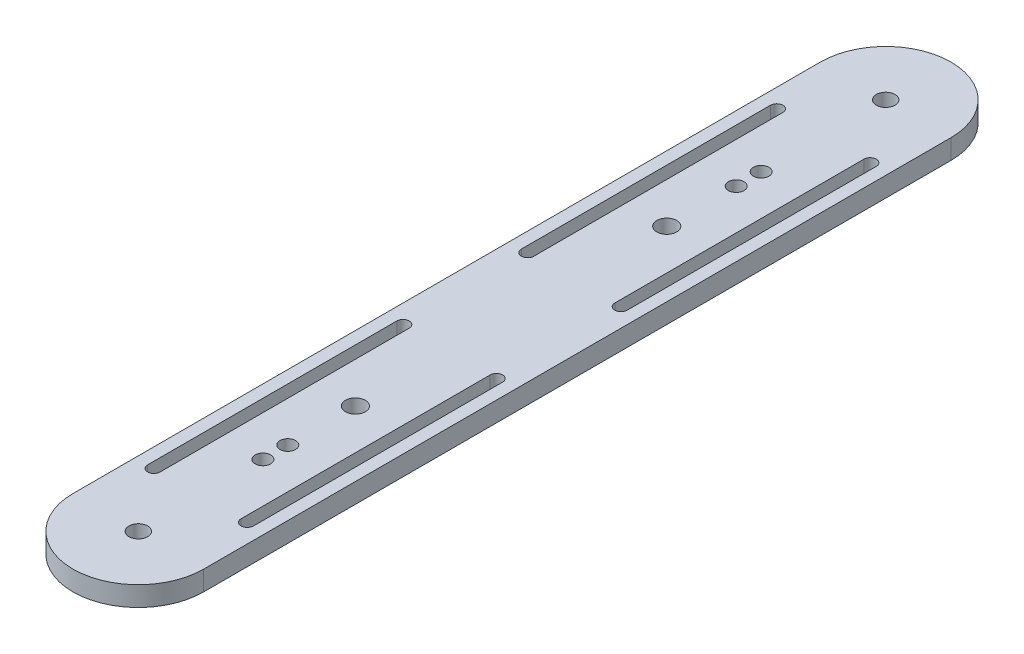
ISO-10303-21;
HEADER;
FILE_DESCRIPTION(('STEP AP214'),'2;1');
FILE_NAME('part.step','',(''),(''),'','','');
FILE_SCHEMA(('AUTOMOTIVE_DESIGN { 1 0 10303 214 1 1 1 1 }'));
ENDSEC;
DATA;
#1=APPLICATION_CONTEXT('core data for automotive mechanical design processes');
#2=APPLICATION_PROTOCOL_DEFINITION('international standard','automotive_design',2000,#1);
#3=PRODUCT_CONTEXT('',#1,'mechanical');
#4=PRODUCT('Part','Part','',(#3));
#5=PRODUCT_RELATED_PRODUCT_CATEGORY('part','',(#4));
#6=PRODUCT_DEFINITION_FORMATION('','',#4);
#7=PRODUCT_DEFINITION_CONTEXT('part definition',#1,'design');
#8=PRODUCT_DEFINITION('design','',#6,#7);
#9=PRODUCT_DEFINITION_SHAPE('','',#8);
#10=(LENGTH_UNIT() NAMED_UNIT(*) SI_UNIT(.MILLI.,.METRE.));
#11=(NAMED_UNIT(*) PLANE_ANGLE_UNIT() SI_UNIT($,.RADIAN.));
#12=(NAMED_UNIT(*) SI_UNIT($,.STERADIAN.) SOLID_ANGLE_UNIT());
#13=UNCERTAINTY_MEASURE_WITH_UNIT(LENGTH_MEASURE(1.E-05),#10,'distance_accuracy_value','');
#14=(GEOMETRIC_REPRESENTATION_CONTEXT(3) GLOBAL_UNCERTAINTY_ASSIGNED_CONTEXT((#13)) GLOBAL_UNIT_ASSIGNED_CONTEXT((#10,
#11,#12)) REPRESENTATION_CONTEXT('',''));
#15=CARTESIAN_POINT('',(0.,0.,0.));
#16=DIRECTION('',(0.,0.,1.));
#17=DIRECTION('',(1.,0.,0.));
#18=AXIS2_PLACEMENT_3D('',#15,#16,#17);
#19=CARTESIAN_POINT('',(0.,3.175,0.));
#20=DIRECTION('',(0.,1.,0.));
#21=DIRECTION('',(0.,0.,1.));
#22=AXIS2_PLACEMENT_3D('',#19,#20,#21);
#23=PLANE('',#22);
#24=CARTESIAN_POINT('',(-7.50000000000002,3.175,70.));
#25=DIRECTION('',(0.,1.,0.));
#26=DIRECTION('',(0.,0.,1.));
#27=AXIS2_PLACEMENT_3D('',#24,#25,#26);
#28=CIRCLE('',#27,0.999999999999999);
#29=CARTESIAN_POINT('',(-6.5,3.175,70.));
#30=VERTEX_POINT('',#29);
#31=CARTESIAN_POINT('',(-8.5,3.175,70.));
#32=VERTEX_POINT('',#31);
#33=EDGE_CURVE('E293',#30,#32,#28,.T.);
#34=ORIENTED_EDGE('',*,*,#33,.F.);
#35=DIRECTION('',(0.,0.,-1.));
#36=VECTOR('',#35,1.);
#37=CARTESIAN_POINT('',(-6.5,3.175,0.));
#38=LINE('',#37,#36);
#39=CARTESIAN_POINT('',(-6.5,3.175,110.));
#40=VERTEX_POINT('',#39);
#41=EDGE_CURVE('E287',#40,#30,#38,.T.);
#42=ORIENTED_EDGE('',*,*,#41,.F.);
#43=CARTESIAN_POINT('',(-7.50000000000013,3.175,110.));
#44=DIRECTION('',(0.,1.,0.));
#45=DIRECTION('',(0.,0.,1.));
#46=AXIS2_PLACEMENT_3D('',#43,#44,#45);
#47=CIRCLE('',#46,0.999999999999999);
#48=CARTESIAN_POINT('',(-8.50000000000013,3.175,110.));
#49=VERTEX_POINT('',#48);
#50=EDGE_CURVE('E289',#49,#40,#47,.T.);
#51=ORIENTED_EDGE('',*,*,#50,.F.);
#52=DIRECTION('',(0.,0.,1.));
#53=VECTOR('',#52,1.);
#54=CARTESIAN_POINT('',(-8.5,3.175,0.));
#55=LINE('',#54,#53);
#56=EDGE_CURVE('E291',#32,#49,#55,.T.);
#57=ORIENTED_EDGE('',*,*,#56,.F.);
#58=EDGE_LOOP('',(#34,#42,#51,#57));
#59=FACE_BOUND('',#58,.T.);
#60=CARTESIAN_POINT('',(7.49999999999986,3.175,110.));
#61=DIRECTION('',(0.,1.,0.));
#62=DIRECTION('',(0.,0.,1.));
#63=AXIS2_PLACEMENT_3D('',#60,#61,#62);
#64=CIRCLE('',#63,0.999999999999999);
#65=CARTESIAN_POINT('',(6.5,3.175,110.));
#66=VERTEX_POINT('',#65);
#67=CARTESIAN_POINT('',(8.5,3.175,110.));
#68=VERTEX_POINT('',#67);
#69=EDGE_CURVE('E285',#66,#68,#64,.T.);
#70=ORIENTED_EDGE('',*,*,#69,.F.);
#71=DIRECTION('',(0.,0.,1.));
#72=VECTOR('',#71,1.);
#73=CARTESIAN_POINT('',(6.5,3.175,0.));
#74=LINE('',#73,#72);
#75=CARTESIAN_POINT('',(6.5,3.175,70.));
#76=VERTEX_POINT('',#75);
#77=EDGE_CURVE('E279',#76,#66,#74,.T.);
#78=ORIENTED_EDGE('',*,*,#77,.F.);
#79=CARTESIAN_POINT('',(7.49999999999997,3.175,70.));
#80=DIRECTION('',(0.,1.,0.));
#81=DIRECTION('',(0.,0.,1.));
#82=AXIS2_PLACEMENT_3D('',#79,#80,#81);
#83=CIRCLE('',#82,0.999999999999999);
#84=CARTESIAN_POINT('',(8.5,3.175,70.));
#85=VERTEX_POINT('',#84);
#86=EDGE_CURVE('E281',#85,#76,#83,.T.);
#87=ORIENTED_EDGE('',*,*,#86,.F.);
#88=DIRECTION('',(0.,0.,-1.));
#89=VECTOR('',#88,1.);
#90=CARTESIAN_POINT('',(8.5,3.175,0.));
#91=LINE('',#90,#89);
#92=EDGE_CURVE('E283',#68,#85,#91,.T.);
#93=ORIENTED_EDGE('',*,*,#92,.F.);
#94=EDGE_LOOP('',(#70,#78,#87,#93));
#95=FACE_BOUND('',#94,.T.);
#96=CARTESIAN_POINT('',(7.5,3.175,50.));
#97=DIRECTION('',(0.,1.,0.));
#98=DIRECTION('',(0.,0.,1.));
#99=AXIS2_PLACEMENT_3D('',#96,#97,#98);
#100=CIRCLE('',#99,0.999999999999999);
#101=CARTESIAN_POINT('',(6.5,3.175,50.));
#102=VERTEX_POINT('',#101);
#103=CARTESIAN_POINT('',(8.5,3.175,50.));
#104=VERTEX_POINT('',#103);
#105=EDGE_CURVE('E277',#102,#104,#100,.T.);
#106=ORIENTED_EDGE('',*,*,#105,.F.);
#107=DIRECTION('',(0.,0.,1.));
#108=VECTOR('',#107,1.);
#109=CARTESIAN_POINT('',(6.5,3.175,0.));
#110=LINE('',#109,#108);
#111=CARTESIAN_POINT('',(6.5,3.175,9.99999999999999));
#112=VERTEX_POINT('',#111);
#113=EDGE_CURVE('E272',#112,#102,#110,.T.);
#114=ORIENTED_EDGE('',*,*,#113,.F.);
#115=CARTESIAN_POINT('',(7.5,3.175,10.));
#116=DIRECTION('',(0.,1.,0.));
#117=DIRECTION('',(0.,0.,1.));
#118=AXIS2_PLACEMENT_3D('',#115,#116,#117);
#119=CIRCLE('',#118,0.999999999999999);
#120=CARTESIAN_POINT('',(8.49999999999999,3.175,10.));
#121=VERTEX_POINT('',#120);
#122=EDGE_CURVE('E180',#121,#112,#119,.T.);
#123=ORIENTED_EDGE('',*,*,#122,.F.);
#124=DIRECTION('',(0.,0.,-1.));
#125=VECTOR('',#124,1.);
#126=CARTESIAN_POINT('',(8.5,3.175,0.));
#127=LINE('',#126,#125);
#128=EDGE_CURVE('E275',#104,#121,#127,.T.);
#129=ORIENTED_EDGE('',*,*,#128,.F.);
#130=EDGE_LOOP('',(#106,#114,#123,#129));
#131=FACE_BOUND('',#130,.T.);
#132=CARTESIAN_POINT('',(-7.5,3.175,50.));
#133=DIRECTION('',(0.,1.,0.));
#134=DIRECTION('',(0.,0.,1.));
#135=AXIS2_PLACEMENT_3D('',#132,#133,#134);
#136=CIRCLE('',#135,0.999999999999999);
#137=CARTESIAN_POINT('',(-8.5,3.175,50.));
#138=VERTEX_POINT('',#137);
#139=CARTESIAN_POINT('',(-6.5,3.175,50.));
#140=VERTEX_POINT('',#139);
#141=EDGE_CURVE('E270',#138,#140,#136,.T.);
#142=ORIENTED_EDGE('',*,*,#141,.F.);
#143=DIRECTION('',(0.,0.,1.));
#144=VECTOR('',#143,1.);
#145=CARTESIAN_POINT('',(-8.5,3.175,0.));
#146=LINE('',#145,#144);
#147=CARTESIAN_POINT('',(-8.5,3.175,10.));
#148=VERTEX_POINT('',#147);
#149=EDGE_CURVE('E257',#148,#138,#146,.T.);
#150=ORIENTED_EDGE('',*,*,#149,.F.);
#151=CARTESIAN_POINT('',(-7.5,3.175,10.));
#152=DIRECTION('',(0.,1.,0.));
#153=DIRECTION('',(0.,0.,1.));
#154=AXIS2_PLACEMENT_3D('',#151,#152,#153);
#155=CIRCLE('',#154,0.999999999999999);
#156=CARTESIAN_POINT('',(-6.5,3.175,9.99999999999999));
#157=VERTEX_POINT('',#156);
#158=EDGE_CURVE('E265',#157,#148,#155,.T.);
#159=ORIENTED_EDGE('',*,*,#158,.F.);
#160=DIRECTION('',(0.,0.,-1.));
#161=VECTOR('',#160,1.);
#162=CARTESIAN_POINT('',(-6.5,3.175,0.));
#163=LINE('',#162,#161);
#164=EDGE_CURVE('E268',#140,#157,#163,.T.);
#165=ORIENTED_EDGE('',*,*,#164,.F.);
#166=EDGE_LOOP('',(#142,#150,#159,#165));
#167=FACE_BOUND('',#166,.T.);
#168=CARTESIAN_POINT('',(0.,3.175,35.15));
#169=DIRECTION('',(0.,1.,0.));
#170=DIRECTION('',(0.,0.,1.));
#171=AXIS2_PLACEMENT_3D('',#168,#169,#170);
#172=CIRCLE('',#171,1.6);
#173=CARTESIAN_POINT('',(0.,3.175,36.75));
#174=VERTEX_POINT('',#173);
#175=EDGE_CURVE('E304',#174,#174,#172,.T.);
#176=ORIENTED_EDGE('',*,*,#175,.F.);
#177=EDGE_LOOP('',(#176));
#178=FACE_BOUND('',#177,.T.);
#179=CARTESIAN_POINT('',(0.,3.175,85.15));
#180=DIRECTION('',(0.,1.,0.));
#181=DIRECTION('',(0.,0.,1.));
#182=AXIS2_PLACEMENT_3D('',#179,#180,#181);
#183=CIRCLE('',#182,1.59999999999999);
#184=CARTESIAN_POINT('',(0.,3.175,86.75));
#185=VERTEX_POINT('',#184);
#186=EDGE_CURVE('E299',#185,#185,#183,.T.);
#187=ORIENTED_EDGE('',*,*,#186,.F.);
#188=EDGE_LOOP('',(#187));
#189=FACE_BOUND('',#188,.T.);
#190=CARTESIAN_POINT('',(0.,3.175,96.));
#191=DIRECTION('',(0.,1.,0.));
#192=DIRECTION('',(0.,0.,1.));
#193=AXIS2_PLACEMENT_3D('',#190,#191,#192);
#194=CIRCLE('',#193,1.25);
#195=CARTESIAN_POINT('',(0.,3.175,97.25));
#196=VERTEX_POINT('',#195);
#197=EDGE_CURVE('E316',#196,#196,#194,.T.);
#198=ORIENTED_EDGE('',*,*,#197,.F.);
#199=EDGE_LOOP('',(#198));
#200=FACE_BOUND('',#199,.T.);
#201=CARTESIAN_POINT('',(0.,3.175,100.));
#202=DIRECTION('',(0.,1.,0.));
#203=DIRECTION('',(0.,0.,1.));
#204=AXIS2_PLACEMENT_3D('',#201,#202,#203);
#205=CIRCLE('',#204,1.25);
#206=CARTESIAN_POINT('',(0.,3.175,101.25));
#207=VERTEX_POINT('',#206);
#208=EDGE_CURVE('E311',#207,#207,#205,.T.);
#209=ORIENTED_EDGE('',*,*,#208,.F.);
#210=EDGE_LOOP('',(#209));
#211=FACE_BOUND('',#210,.T.);
#212=CARTESIAN_POINT('',(0.,3.175,20.));
#213=DIRECTION('',(0.,-1.,0.));
#214=DIRECTION('',(0.,0.,-1.));
#215=AXIS2_PLACEMENT_3D('',#212,#213,#214);
#216=CIRCLE('',#215,1.25);
#217=CARTESIAN_POINT('',(0.,3.175,18.75));
#218=VERTEX_POINT('',#217);
#219=EDGE_CURVE('E320',#218,#218,#216,.T.);
#220=ORIENTED_EDGE('',*,*,#219,.T.);
#221=EDGE_LOOP('',(#220));
#222=FACE_BOUND('',#221,.T.);
#223=CARTESIAN_POINT('',(0.,3.175,24.));
#224=DIRECTION('',(0.,-1.,0.));
#225=DIRECTION('',(0.,0.,-1.));
#226=AXIS2_PLACEMENT_3D('',#223,#224,#225);
#227=CIRCLE('',#226,1.25);
#228=CARTESIAN_POINT('',(0.,3.175,22.75));
#229=VERTEX_POINT('',#228);
#230=EDGE_CURVE('E319',#229,#229,#227,.T.);
#231=ORIENTED_EDGE('',*,*,#230,.T.);
#232=EDGE_LOOP('',(#231));
#233=FACE_BOUND('',#232,.T.);
#234=CARTESIAN_POINT('',(0.,3.175,0.));
#235=DIRECTION('',(0.,1.,0.));
#236=DIRECTION('',(0.,0.,1.));
#237=AXIS2_PLACEMENT_3D('',#234,#235,#236);
#238=CIRCLE('',#237,1.5);
#239=CARTESIAN_POINT('',(0.,3.175,1.5));
#240=VERTEX_POINT('',#239);
#241=EDGE_CURVE('E333',#240,#240,#238,.T.);
#242=ORIENTED_EDGE('',*,*,#241,.F.);
#243=EDGE_LOOP('',(#242));
#244=FACE_BOUND('',#243,.T.);
#245=CARTESIAN_POINT('',(0.,3.175,0.));
#246=DIRECTION('',(0.,1.,0.));
#247=DIRECTION('',(0.,0.,1.));
#248=AXIS2_PLACEMENT_3D('',#245,#246,#247);
#249=CIRCLE('',#248,10.5);
#250=CARTESIAN_POINT('',(10.5,3.175,0.));
#251=VERTEX_POINT('',#250);
#252=CARTESIAN_POINT('',(-10.5,3.175,0.));
#253=VERTEX_POINT('',#252);
#254=EDGE_CURVE('E339',#251,#253,#249,.T.);
#255=ORIENTED_EDGE('',*,*,#254,.T.);
#256=DIRECTION('',(0.,0.,1.));
#257=VECTOR('',#256,1.);
#258=CARTESIAN_POINT('',(-10.5,3.175,0.));
#259=LINE('',#258,#257);
#260=CARTESIAN_POINT('',(-10.5,3.175,120.));
#261=VERTEX_POINT('',#260);
#262=EDGE_CURVE('E342',#253,#261,#259,.T.);
#263=ORIENTED_EDGE('',*,*,#262,.T.);
#264=CARTESIAN_POINT('',(0.,3.175,120.));
#265=DIRECTION('',(0.,1.,0.));
#266=DIRECTION('',(0.,0.,1.));
#267=AXIS2_PLACEMENT_3D('',#264,#265,#266);
#268=CIRCLE('',#267,10.5);
#269=CARTESIAN_POINT('',(10.5,3.175,120.));
#270=VERTEX_POINT('',#269);
#271=EDGE_CURVE('E345',#261,#270,#268,.T.);
#272=ORIENTED_EDGE('',*,*,#271,.T.);
#273=DIRECTION('',(0.,0.,-1.));
#274=VECTOR('',#273,1.);
#275=CARTESIAN_POINT('',(10.5,3.175,0.));
#276=LINE('',#275,#274);
#277=EDGE_CURVE('E347',#270,#251,#276,.T.);
#278=ORIENTED_EDGE('',*,*,#277,.T.);
#279=EDGE_LOOP('',(#255,#263,#272,#278));
#280=FACE_BOUND('',#279,.T.);
#281=CARTESIAN_POINT('',(0.,3.175,120.));
#282=DIRECTION('',(0.,1.,0.));
#283=DIRECTION('',(0.,0.,1.));
#284=AXIS2_PLACEMENT_3D('',#281,#282,#283);
#285=CIRCLE('',#284,1.5);
#286=CARTESIAN_POINT('',(0.,3.175,121.5));
#287=VERTEX_POINT('',#286);
#288=EDGE_CURVE('E326',#287,#287,#285,.T.);
#289=ORIENTED_EDGE('',*,*,#288,.F.);
#290=EDGE_LOOP('',(#289));
#291=FACE_BOUND('',#290,.T.);
#292=ADVANCED_FACE('F33',(#59,#95,#131,#167,#178,#189,#200,#211,#222,#233,#244,#280,#291),#23,.T.);
#293=CARTESIAN_POINT('',(0.,0.,0.));
#294=DIRECTION('',(0.,1.,0.));
#295=DIRECTION('',(0.,0.,1.));
#296=AXIS2_PLACEMENT_3D('',#293,#294,#295);
#297=PLANE('',#296);
#298=DIRECTION('',(0.,0.,1.));
#299=VECTOR('',#298,1.);
#300=CARTESIAN_POINT('',(-6.5,0.,70.));
#301=LINE('',#300,#299);
#302=CARTESIAN_POINT('',(-6.5,0.,70.));
#303=VERTEX_POINT('',#302);
#304=CARTESIAN_POINT('',(-6.5,0.,110.));
#305=VERTEX_POINT('',#304);
#306=EDGE_CURVE('E229',#303,#305,#301,.T.);
#307=ORIENTED_EDGE('',*,*,#306,.F.);
#308=CARTESIAN_POINT('',(-7.50000000000002,0.,70.));
#309=DIRECTION('',(0.,-1.,0.));
#310=DIRECTION('',(0.,0.,1.));
#311=AXIS2_PLACEMENT_3D('',#308,#309,#310);
#312=CIRCLE('',#311,0.999999999999999);
#313=CARTESIAN_POINT('',(-8.5,0.,70.));
#314=VERTEX_POINT('',#313);
#315=EDGE_CURVE('E227',#314,#303,#312,.T.);
#316=ORIENTED_EDGE('',*,*,#315,.F.);
#317=DIRECTION('',(0.,0.,-1.));
#318=VECTOR('',#317,1.);
#319=CARTESIAN_POINT('',(-8.5,0.,110.));
#320=LINE('',#319,#318);
#321=CARTESIAN_POINT('',(-8.50000000000013,0.,110.));
#322=VERTEX_POINT('',#321);
#323=EDGE_CURVE('E234',#322,#314,#320,.T.);
#324=ORIENTED_EDGE('',*,*,#323,.F.);
#325=CARTESIAN_POINT('',(-7.50000000000013,0.,110.));
#326=DIRECTION('',(0.,-1.,0.));
#327=DIRECTION('',(0.,0.,1.));
#328=AXIS2_PLACEMENT_3D('',#325,#326,#327);
#329=CIRCLE('',#328,0.999999999999999);
#330=EDGE_CURVE('E231',#305,#322,#329,.T.);
#331=ORIENTED_EDGE('',*,*,#330,.F.);
#332=EDGE_LOOP('',(#307,#316,#324,#331));
#333=FACE_BOUND('',#332,.T.);
#334=DIRECTION('',(0.,0.,-1.));
#335=VECTOR('',#334,1.);
#336=CARTESIAN_POINT('',(6.5,0.,70.));
#337=LINE('',#336,#335);
#338=CARTESIAN_POINT('',(6.5,0.,110.));
#339=VERTEX_POINT('',#338);
#340=CARTESIAN_POINT('',(6.49999999999997,0.,70.));
#341=VERTEX_POINT('',#340);
#342=EDGE_CURVE('E210',#339,#341,#337,.T.);
#343=ORIENTED_EDGE('',*,*,#342,.F.);
#344=CARTESIAN_POINT('',(7.49999999999986,0.,110.));
#345=DIRECTION('',(0.,-1.,0.));
#346=DIRECTION('',(0.,0.,-1.));
#347=AXIS2_PLACEMENT_3D('',#344,#345,#346);
#348=CIRCLE('',#347,0.999999999999999);
#349=CARTESIAN_POINT('',(8.5,0.,110.));
#350=VERTEX_POINT('',#349);
#351=EDGE_CURVE('E208',#350,#339,#348,.T.);
#352=ORIENTED_EDGE('',*,*,#351,.F.);
#353=DIRECTION('',(0.,0.,1.));
#354=VECTOR('',#353,1.);
#355=CARTESIAN_POINT('',(8.5,0.,110.));
#356=LINE('',#355,#354);
#357=CARTESIAN_POINT('',(8.5,0.,70.));
#358=VERTEX_POINT('',#357);
#359=EDGE_CURVE('E216',#358,#350,#356,.T.);
#360=ORIENTED_EDGE('',*,*,#359,.F.);
#361=CARTESIAN_POINT('',(7.49999999999997,0.,70.));
#362=DIRECTION('',(0.,-1.,0.));
#363=DIRECTION('',(0.,0.,-1.));
#364=AXIS2_PLACEMENT_3D('',#361,#362,#363);
#365=CIRCLE('',#364,0.999999999999999);
#366=EDGE_CURVE('E213',#341,#358,#365,.T.);
#367=ORIENTED_EDGE('',*,*,#366,.F.);
#368=EDGE_LOOP('',(#343,#352,#360,#367));
#369=FACE_BOUND('',#368,.T.);
#370=DIRECTION('',(0.,0.,-1.));
#371=VECTOR('',#370,1.);
#372=CARTESIAN_POINT('',(6.5,0.,50.));
#373=LINE('',#372,#371);
#374=CARTESIAN_POINT('',(6.5,0.,50.));
#375=VERTEX_POINT('',#374);
#376=CARTESIAN_POINT('',(6.5,0.,9.99999999999999));
#377=VERTEX_POINT('',#376);
#378=EDGE_CURVE('E188',#375,#377,#373,.T.);
#379=ORIENTED_EDGE('',*,*,#378,.F.);
#380=CARTESIAN_POINT('',(7.5,0.,50.));
#381=DIRECTION('',(0.,-1.,0.));
#382=DIRECTION('',(0.,0.,1.));
#383=AXIS2_PLACEMENT_3D('',#380,#381,#382);
#384=CIRCLE('',#383,0.999999999999999);
#385=CARTESIAN_POINT('',(8.5,0.,50.));
#386=VERTEX_POINT('',#385);
#387=EDGE_CURVE('E193',#386,#375,#384,.T.);
#388=ORIENTED_EDGE('',*,*,#387,.F.);
#389=DIRECTION('',(0.,0.,1.));
#390=VECTOR('',#389,1.);
#391=CARTESIAN_POINT('',(8.5,0.,10.));
#392=LINE('',#391,#390);
#393=CARTESIAN_POINT('',(8.49999999999999,0.,10.));
#394=VERTEX_POINT('',#393);
#395=EDGE_CURVE('E198',#394,#386,#392,.T.);
#396=ORIENTED_EDGE('',*,*,#395,.F.);
#397=CARTESIAN_POINT('',(7.5,0.,10.));
#398=DIRECTION('',(0.,-1.,0.));
#399=DIRECTION('',(0.,0.,1.));
#400=AXIS2_PLACEMENT_3D('',#397,#398,#399);
#401=CIRCLE('',#400,0.999999999999999);
#402=EDGE_CURVE('E177',#377,#394,#401,.T.);
#403=ORIENTED_EDGE('',*,*,#402,.F.);
#404=EDGE_LOOP('',(#379,#388,#396,#403));
#405=FACE_BOUND('',#404,.T.);
#406=DIRECTION('',(0.,0.,-1.));
#407=VECTOR('',#406,1.);
#408=CARTESIAN_POINT('',(-8.5,0.,10.));
#409=LINE('',#408,#407);
#410=CARTESIAN_POINT('',(-8.5,0.,50.));
#411=VERTEX_POINT('',#410);
#412=CARTESIAN_POINT('',(-8.5,0.,10.));
#413=VERTEX_POINT('',#412);
#414=EDGE_CURVE('E245',#411,#413,#409,.T.);
#415=ORIENTED_EDGE('',*,*,#414,.F.);
#416=CARTESIAN_POINT('',(-7.5,0.,50.));
#417=DIRECTION('',(0.,-1.,0.));
#418=DIRECTION('',(0.,0.,-1.));
#419=AXIS2_PLACEMENT_3D('',#416,#417,#418);
#420=CIRCLE('',#419,0.999999999999999);
#421=CARTESIAN_POINT('',(-6.5,0.,50.));
#422=VERTEX_POINT('',#421);
#423=EDGE_CURVE('E205',#422,#411,#420,.T.);
#424=ORIENTED_EDGE('',*,*,#423,.F.);
#425=DIRECTION('',(0.,0.,1.));
#426=VECTOR('',#425,1.);
#427=CARTESIAN_POINT('',(-6.5,0.,50.));
#428=LINE('',#427,#426);
#429=CARTESIAN_POINT('',(-6.5,0.,9.99999999999999));
#430=VERTEX_POINT('',#429);
#431=EDGE_CURVE('E251',#430,#422,#428,.T.);
#432=ORIENTED_EDGE('',*,*,#431,.F.);
#433=CARTESIAN_POINT('',(-7.5,0.,10.));
#434=DIRECTION('',(0.,-1.,0.));
#435=DIRECTION('',(0.,0.,-1.));
#436=AXIS2_PLACEMENT_3D('',#433,#434,#435);
#437=CIRCLE('',#436,0.999999999999999);
#438=EDGE_CURVE('E248',#413,#430,#437,.T.);
#439=ORIENTED_EDGE('',*,*,#438,.F.);
#440=EDGE_LOOP('',(#415,#424,#432,#439));
#441=FACE_BOUND('',#440,.T.);
#442=CARTESIAN_POINT('',(0.,0.,35.15));
#443=DIRECTION('',(0.,1.,0.));
#444=DIRECTION('',(0.,0.,1.));
#445=AXIS2_PLACEMENT_3D('',#442,#443,#444);
#446=CIRCLE('',#445,1.6);
#447=CARTESIAN_POINT('',(0.,0.,36.75));
#448=VERTEX_POINT('',#447);
#449=EDGE_CURVE('E296',#448,#448,#446,.T.);
#450=ORIENTED_EDGE('',*,*,#449,.T.);
#451=EDGE_LOOP('',(#450));
#452=FACE_BOUND('',#451,.T.);
#453=CARTESIAN_POINT('',(0.,0.,85.15));
#454=DIRECTION('',(0.,1.,0.));
#455=DIRECTION('',(0.,0.,1.));
#456=AXIS2_PLACEMENT_3D('',#453,#454,#455);
#457=CIRCLE('',#456,1.59999999999999);
#458=CARTESIAN_POINT('',(0.,0.,86.75));
#459=VERTEX_POINT('',#458);
#460=EDGE_CURVE('E295',#459,#459,#457,.T.);
#461=ORIENTED_EDGE('',*,*,#460,.T.);
#462=EDGE_LOOP('',(#461));
#463=FACE_BOUND('',#462,.T.);
#464=CARTESIAN_POINT('',(0.,0.,96.));
#465=DIRECTION('',(0.,1.,0.));
#466=DIRECTION('',(0.,0.,1.));
#467=AXIS2_PLACEMENT_3D('',#464,#465,#466);
#468=CIRCLE('',#467,1.25);
#469=CARTESIAN_POINT('',(0.,0.,97.25));
#470=VERTEX_POINT('',#469);
#471=EDGE_CURVE('E308',#470,#470,#468,.T.);
#472=ORIENTED_EDGE('',*,*,#471,.T.);
#473=EDGE_LOOP('',(#472));
#474=FACE_BOUND('',#473,.T.);
#475=CARTESIAN_POINT('',(0.,0.,100.));
#476=DIRECTION('',(0.,1.,0.));
#477=DIRECTION('',(0.,0.,1.));
#478=AXIS2_PLACEMENT_3D('',#475,#476,#477);
#479=CIRCLE('',#478,1.25);
#480=CARTESIAN_POINT('',(0.,0.,101.25));
#481=VERTEX_POINT('',#480);
#482=EDGE_CURVE('E307',#481,#481,#479,.T.);
#483=ORIENTED_EDGE('',*,*,#482,.T.);
#484=EDGE_LOOP('',(#483));
#485=FACE_BOUND('',#484,.T.);
#486=CARTESIAN_POINT('',(0.,0.,20.));
#487=DIRECTION('',(0.,1.,0.));
#488=DIRECTION('',(0.,0.,1.));
#489=AXIS2_PLACEMENT_3D('',#486,#487,#488);
#490=CIRCLE('',#489,1.25);
#491=CARTESIAN_POINT('',(0.,0.,21.25));
#492=VERTEX_POINT('',#491);
#493=EDGE_CURVE('E37',#492,#492,#490,.T.);
#494=ORIENTED_EDGE('',*,*,#493,.T.);
#495=EDGE_LOOP('',(#494));
#496=FACE_BOUND('',#495,.T.);
#497=CARTESIAN_POINT('',(0.,0.,24.));
#498=DIRECTION('',(0.,1.,0.));
#499=DIRECTION('',(0.,0.,1.));
#500=AXIS2_PLACEMENT_3D('',#497,#498,#499);
#501=CIRCLE('',#500,1.25);
#502=CARTESIAN_POINT('',(0.,0.,25.25));
#503=VERTEX_POINT('',#502);
#504=EDGE_CURVE('E323',#503,#503,#501,.T.);
#505=ORIENTED_EDGE('',*,*,#504,.T.);
#506=EDGE_LOOP('',(#505));
#507=FACE_BOUND('',#506,.T.);
#508=CARTESIAN_POINT('',(0.,0.,0.));
#509=DIRECTION('',(0.,1.,0.));
#510=DIRECTION('',(0.,0.,1.));
#511=AXIS2_PLACEMENT_3D('',#508,#509,#510);
#512=CIRCLE('',#511,10.5);
#513=CARTESIAN_POINT('',(10.5,0.,0.));
#514=VERTEX_POINT('',#513);
#515=CARTESIAN_POINT('',(-10.5,0.,0.));
#516=VERTEX_POINT('',#515);
#517=EDGE_CURVE('E336',#514,#516,#512,.T.);
#518=ORIENTED_EDGE('',*,*,#517,.F.);
#519=DIRECTION('',(0.,0.,-1.));
#520=VECTOR('',#519,1.);
#521=CARTESIAN_POINT('',(10.5,0.,0.));
#522=LINE('',#521,#520);
#523=CARTESIAN_POINT('',(10.5,0.,120.));
#524=VERTEX_POINT('',#523);
#525=EDGE_CURVE('E343',#524,#514,#522,.T.);
#526=ORIENTED_EDGE('',*,*,#525,.F.);
#527=CARTESIAN_POINT('',(0.,0.,120.));
#528=DIRECTION('',(0.,1.,0.));
#529=DIRECTION('',(0.,0.,1.));
#530=AXIS2_PLACEMENT_3D('',#527,#528,#529);
#531=CIRCLE('',#530,10.5);
#532=CARTESIAN_POINT('',(-10.5,0.,120.));
#533=VERTEX_POINT('',#532);
#534=EDGE_CURVE('E354',#533,#524,#531,.T.);
#535=ORIENTED_EDGE('',*,*,#534,.F.);
#536=DIRECTION('',(0.,0.,1.));
#537=VECTOR('',#536,1.);
#538=CARTESIAN_POINT('',(-10.5,0.,0.));
#539=LINE('',#538,#537);
#540=EDGE_CURVE('E352',#516,#533,#539,.T.);
#541=ORIENTED_EDGE('',*,*,#540,.F.);
#542=EDGE_LOOP('',(#518,#526,#535,#541));
#543=FACE_BOUND('',#542,.T.);
#544=CARTESIAN_POINT('',(0.,0.,0.));
#545=DIRECTION('',(0.,1.,0.));
#546=DIRECTION('',(0.,0.,1.));
#547=AXIS2_PLACEMENT_3D('',#544,#545,#546);
#548=CIRCLE('',#547,1.5);
#549=CARTESIAN_POINT('',(0.,0.,1.5));
#550=VERTEX_POINT('',#549);
#551=EDGE_CURVE('E329',#550,#550,#548,.T.);
#552=ORIENTED_EDGE('',*,*,#551,.T.);
#553=EDGE_LOOP('',(#552));
#554=FACE_BOUND('',#553,.T.);
#555=CARTESIAN_POINT('',(0.,0.,120.));
#556=DIRECTION('',(0.,1.,0.));
#557=DIRECTION('',(0.,0.,1.));
#558=AXIS2_PLACEMENT_3D('',#555,#556,#557);
#559=CIRCLE('',#558,1.5);
#560=CARTESIAN_POINT('',(0.,0.,121.5));
#561=VERTEX_POINT('',#560);
#562=EDGE_CURVE('E330',#561,#561,#559,.T.);
#563=ORIENTED_EDGE('',*,*,#562,.T.);
#564=EDGE_LOOP('',(#563));
#565=FACE_BOUND('',#564,.T.);
#566=ADVANCED_FACE('F195',(#333,#369,#405,#441,#452,#463,#474,#485,#496,#507,#543,#554,#565),
#297,.F.);
#567=CARTESIAN_POINT('',(0.,3.175,0.));
#568=DIRECTION('',(0.,-1.,0.));
#569=DIRECTION('',(0.,0.,-1.));
#570=AXIS2_PLACEMENT_3D('',#567,#568,#569);
#571=CYLINDRICAL_SURFACE('',#570,10.5);
#572=ORIENTED_EDGE('',*,*,#517,.T.);
#573=DIRECTION('',(0.,-1.,0.));
#574=VECTOR('',#573,1.);
#575=CARTESIAN_POINT('',(-10.5,3.175,0.));
#576=LINE('',#575,#574);
#577=EDGE_CURVE('E11',#253,#516,#576,.T.);
#578=ORIENTED_EDGE('',*,*,#577,.F.);
#579=ORIENTED_EDGE('',*,*,#254,.F.);
#580=DIRECTION('',(0.,-1.,0.));
#581=VECTOR('',#580,1.);
#582=CARTESIAN_POINT('',(10.5,3.175,0.));
#583=LINE('',#582,#581);
#584=EDGE_CURVE('E349',#251,#514,#583,.T.);
#585=ORIENTED_EDGE('',*,*,#584,.T.);
#586=EDGE_LOOP('',(#572,#578,#579,#585));
#587=FACE_BOUND('',#586,.T.);
#588=ADVANCED_FACE('F35',(#587),#571,.T.);
#589=CARTESIAN_POINT('',(-10.5,3.175,0.));
#590=DIRECTION('',(1.,0.,0.));
#591=DIRECTION('',(0.,0.,-1.));
#592=AXIS2_PLACEMENT_3D('',#589,#590,#591);
#593=PLANE('',#592);
#594=ORIENTED_EDGE('',*,*,#540,.T.);
#595=DIRECTION('',(0.,-1.,0.));
#596=VECTOR('',#595,1.);
#597=CARTESIAN_POINT('',(-10.5,3.175,120.));
#598=LINE('',#597,#596);
#599=EDGE_CURVE('E42',#261,#533,#598,.T.);
#600=ORIENTED_EDGE('',*,*,#599,.F.);
#601=ORIENTED_EDGE('',*,*,#262,.F.);
#602=ORIENTED_EDGE('',*,*,#577,.T.);
#603=EDGE_LOOP('',(#594,#600,#601,#602));
#604=FACE_BOUND('',#603,.T.);
#605=ADVANCED_FACE('F408',(#604),#593,.F.);
#606=CARTESIAN_POINT('',(0.,3.175,120.));
#607=DIRECTION('',(0.,-1.,0.));
#608=DIRECTION('',(0.,0.,-1.));
#609=AXIS2_PLACEMENT_3D('',#606,#607,#608);
#610=CYLINDRICAL_SURFACE('',#609,10.5);
#611=ORIENTED_EDGE('',*,*,#534,.T.);
#612=DIRECTION('',(0.,-1.,0.));
#613=VECTOR('',#612,1.);
#614=CARTESIAN_POINT('',(10.5,3.175,120.));
#615=LINE('',#614,#613);
#616=EDGE_CURVE('E359',#270,#524,#615,.T.);
#617=ORIENTED_EDGE('',*,*,#616,.F.);
#618=ORIENTED_EDGE('',*,*,#271,.F.);
#619=ORIENTED_EDGE('',*,*,#599,.T.);
#620=EDGE_LOOP('',(#611,#617,#618,#619));
#621=FACE_BOUND('',#620,.T.);
#622=ADVANCED_FACE('F405',(#621),#610,.T.);
#623=CARTESIAN_POINT('',(10.5,3.175,0.));
#624=DIRECTION('',(-1.,0.,0.));
#625=DIRECTION('',(0.,0.,1.));
#626=AXIS2_PLACEMENT_3D('',#623,#624,#625);
#627=PLANE('',#626);
#628=ORIENTED_EDGE('',*,*,#525,.T.);
#629=ORIENTED_EDGE('',*,*,#584,.F.);
#630=ORIENTED_EDGE('',*,*,#277,.F.);
#631=ORIENTED_EDGE('',*,*,#616,.T.);
#632=EDGE_LOOP('',(#628,#629,#630,#631));
#633=FACE_BOUND('',#632,.T.);
#634=ADVANCED_FACE('F402',(#633),#627,.F.);
#635=CARTESIAN_POINT('',(0.,3.175,0.));
#636=DIRECTION('',(0.,-1.,0.));
#637=DIRECTION('',(0.,0.,-1.));
#638=AXIS2_PLACEMENT_3D('',#635,#636,#637);
#639=CYLINDRICAL_SURFACE('',#638,1.5);
#640=ORIENTED_EDGE('',*,*,#241,.T.);
#641=EDGE_LOOP('',(#640));
#642=FACE_BOUND('',#641,.T.);
#643=ORIENTED_EDGE('',*,*,#551,.F.);
#644=EDGE_LOOP('',(#643));
#645=FACE_BOUND('',#644,.T.);
#646=ADVANCED_FACE('F399',(#642,#645),#639,.F.);
#647=CARTESIAN_POINT('',(0.,3.175,120.));
#648=DIRECTION('',(0.,-1.,0.));
#649=DIRECTION('',(0.,0.,-1.));
#650=AXIS2_PLACEMENT_3D('',#647,#648,#649);
#651=CYLINDRICAL_SURFACE('',#650,1.5);
#652=ORIENTED_EDGE('',*,*,#288,.T.);
#653=EDGE_LOOP('',(#652));
#654=FACE_BOUND('',#653,.T.);
#655=ORIENTED_EDGE('',*,*,#562,.F.);
#656=EDGE_LOOP('',(#655));
#657=FACE_BOUND('',#656,.T.);
#658=ADVANCED_FACE('F383',(#654,#657),#651,.F.);
#659=CARTESIAN_POINT('',(0.,3.175,24.));
#660=DIRECTION('',(0.,-1.,0.));
#661=DIRECTION('',(0.,0.,-1.));
#662=AXIS2_PLACEMENT_3D('',#659,#660,#661);
#663=CYLINDRICAL_SURFACE('',#662,1.25);
#664=ORIENTED_EDGE('',*,*,#230,.F.);
#665=EDGE_LOOP('',(#664));
#666=FACE_BOUND('',#665,.T.);
#667=ORIENTED_EDGE('',*,*,#504,.F.);
#668=EDGE_LOOP('',(#667));
#669=FACE_BOUND('',#668,.T.);
#670=ADVANCED_FACE('F373',(#666,#669),#663,.F.);
#671=CARTESIAN_POINT('',(0.,3.175,20.));
#672=DIRECTION('',(0.,-1.,0.));
#673=DIRECTION('',(0.,0.,-1.));
#674=AXIS2_PLACEMENT_3D('',#671,#672,#673);
#675=CYLINDRICAL_SURFACE('',#674,1.25);
#676=ORIENTED_EDGE('',*,*,#219,.F.);
#677=EDGE_LOOP('',(#676));
#678=FACE_BOUND('',#677,.T.);
#679=ORIENTED_EDGE('',*,*,#493,.F.);
#680=EDGE_LOOP('',(#679));
#681=FACE_BOUND('',#680,.T.);
#682=ADVANCED_FACE('F370',(#678,#681),#675,.F.);
#683=CARTESIAN_POINT('',(0.,0.,100.));
#684=DIRECTION('',(0.,1.,0.));
#685=DIRECTION('',(0.,0.,1.));
#686=AXIS2_PLACEMENT_3D('',#683,#684,#685);
#687=CYLINDRICAL_SURFACE('',#686,1.25);
#688=ORIENTED_EDGE('',*,*,#208,.T.);
#689=EDGE_LOOP('',(#688));
#690=FACE_BOUND('',#689,.T.);
#691=ORIENTED_EDGE('',*,*,#482,.F.);
#692=EDGE_LOOP('',(#691));
#693=FACE_BOUND('',#692,.T.);
#694=ADVANCED_FACE('F372',(#690,#693),#687,.F.);
#695=CARTESIAN_POINT('',(0.,0.,96.));
#696=DIRECTION('',(0.,1.,0.));
#697=DIRECTION('',(0.,0.,1.));
#698=AXIS2_PLACEMENT_3D('',#695,#696,#697);
#699=CYLINDRICAL_SURFACE('',#698,1.25);
#700=ORIENTED_EDGE('',*,*,#197,.T.);
#701=EDGE_LOOP('',(#700));
#702=FACE_BOUND('',#701,.T.);
#703=ORIENTED_EDGE('',*,*,#471,.F.);
#704=EDGE_LOOP('',(#703));
#705=FACE_BOUND('',#704,.T.);
#706=ADVANCED_FACE('F380',(#702,#705),#699,.F.);
#707=CARTESIAN_POINT('',(0.,0.,85.15));
#708=DIRECTION('',(0.,1.,0.));
#709=DIRECTION('',(0.,0.,1.));
#710=AXIS2_PLACEMENT_3D('',#707,#708,#709);
#711=CYLINDRICAL_SURFACE('',#710,1.59999999999999);
#712=ORIENTED_EDGE('',*,*,#186,.T.);
#713=EDGE_LOOP('',(#712));
#714=FACE_BOUND('',#713,.T.);
#715=ORIENTED_EDGE('',*,*,#460,.F.);
#716=EDGE_LOOP('',(#715));
#717=FACE_BOUND('',#716,.T.);
#718=ADVANCED_FACE('F637',(#714,#717),#711,.F.);
#719=CARTESIAN_POINT('',(0.,0.,35.15));
#720=DIRECTION('',(0.,1.,0.));
#721=DIRECTION('',(0.,0.,1.));
#722=AXIS2_PLACEMENT_3D('',#719,#720,#721);
#723=CYLINDRICAL_SURFACE('',#722,1.6);
#724=ORIENTED_EDGE('',*,*,#175,.T.);
#725=EDGE_LOOP('',(#724));
#726=FACE_BOUND('',#725,.T.);
#727=ORIENTED_EDGE('',*,*,#449,.F.);
#728=EDGE_LOOP('',(#727));
#729=FACE_BOUND('',#728,.T.);
#730=ADVANCED_FACE('F485',(#726,#729),#723,.F.);
#731=CARTESIAN_POINT('',(-7.5,40.,50.));
#732=DIRECTION('',(0.,-1.,0.));
#733=DIRECTION('',(0.,0.,-1.));
#734=AXIS2_PLACEMENT_3D('',#731,#732,#733);
#735=CYLINDRICAL_SURFACE('',#734,0.999999999999999);
#736=ORIENTED_EDGE('',*,*,#141,.T.);
#737=DIRECTION('',(0.,-1.,0.));
#738=VECTOR('',#737,1.);
#739=CARTESIAN_POINT('',(-6.5,40.,50.));
#740=LINE('',#739,#738);
#741=EDGE_CURVE('E255',#140,#422,#740,.T.);
#742=ORIENTED_EDGE('',*,*,#741,.T.);
#743=ORIENTED_EDGE('',*,*,#423,.T.);
#744=DIRECTION('',(0.,-1.,0.));
#745=VECTOR('',#744,1.);
#746=CARTESIAN_POINT('',(-8.5,40.,50.));
#747=LINE('',#746,#745);
#748=EDGE_CURVE('E254',#138,#411,#747,.T.);
#749=ORIENTED_EDGE('',*,*,#748,.F.);
#750=EDGE_LOOP('',(#736,#742,#743,#749));
#751=FACE_BOUND('',#750,.T.);
#752=ADVANCED_FACE('F479',(#751),#735,.F.);
#753=CARTESIAN_POINT('',(-6.5,40.,50.));
#754=DIRECTION('',(1.,0.,0.));
#755=DIRECTION('',(0.,0.,-1.));
#756=AXIS2_PLACEMENT_3D('',#753,#754,#755);
#757=PLANE('',#756);
#758=ORIENTED_EDGE('',*,*,#164,.T.);
#759=DIRECTION('',(0.,-1.,0.));
#760=VECTOR('',#759,1.);
#761=CARTESIAN_POINT('',(-6.5,40.,9.99999999999999));
#762=LINE('',#761,#760);
#763=EDGE_CURVE('E258',#157,#430,#762,.T.);
#764=ORIENTED_EDGE('',*,*,#763,.T.);
#765=ORIENTED_EDGE('',*,*,#431,.T.);
#766=ORIENTED_EDGE('',*,*,#741,.F.);
#767=EDGE_LOOP('',(#758,#764,#765,#766));
#768=FACE_BOUND('',#767,.T.);
#769=ADVANCED_FACE('F484',(#768),#757,.F.);
#770=CARTESIAN_POINT('',(-7.5,40.,10.));
#771=DIRECTION('',(0.,-1.,0.));
#772=DIRECTION('',(0.,0.,-1.));
#773=AXIS2_PLACEMENT_3D('',#770,#771,#772);
#774=CYLINDRICAL_SURFACE('',#773,0.999999999999999);
#775=ORIENTED_EDGE('',*,*,#158,.T.);
#776=DIRECTION('',(0.,-1.,0.));
#777=VECTOR('',#776,1.);
#778=CARTESIAN_POINT('',(-8.5,40.,10.));
#779=LINE('',#778,#777);
#780=EDGE_CURVE('E260',#148,#413,#779,.T.);
#781=ORIENTED_EDGE('',*,*,#780,.T.);
#782=ORIENTED_EDGE('',*,*,#438,.T.);
#783=ORIENTED_EDGE('',*,*,#763,.F.);
#784=EDGE_LOOP('',(#775,#781,#782,#783));
#785=FACE_BOUND('',#784,.T.);
#786=ADVANCED_FACE('F497',(#785),#774,.F.);
#787=CARTESIAN_POINT('',(-8.5,40.,10.));
#788=DIRECTION('',(-1.,0.,0.));
#789=DIRECTION('',(0.,0.,1.));
#790=AXIS2_PLACEMENT_3D('',#787,#788,#789);
#791=PLANE('',#790);
#792=ORIENTED_EDGE('',*,*,#149,.T.);
#793=ORIENTED_EDGE('',*,*,#748,.T.);
#794=ORIENTED_EDGE('',*,*,#414,.T.);
#795=ORIENTED_EDGE('',*,*,#780,.F.);
#796=EDGE_LOOP('',(#792,#793,#794,#795));
#797=FACE_BOUND('',#796,.T.);
#798=ADVANCED_FACE('F507',(#797),#791,.F.);
#799=CARTESIAN_POINT('',(7.5,40.,50.));
#800=DIRECTION('',(0.,-1.,0.));
#801=DIRECTION('',(0.,0.,-1.));
#802=AXIS2_PLACEMENT_3D('',#799,#800,#801);
#803=CYLINDRICAL_SURFACE('',#802,0.999999999999999);
#804=ORIENTED_EDGE('',*,*,#105,.T.);
#805=DIRECTION('',(0.,-1.,0.));
#806=VECTOR('',#805,1.);
#807=CARTESIAN_POINT('',(8.5,40.,50.));
#808=LINE('',#807,#806);
#809=EDGE_CURVE('E203',#104,#386,#808,.T.);
#810=ORIENTED_EDGE('',*,*,#809,.T.);
#811=ORIENTED_EDGE('',*,*,#387,.T.);
#812=DIRECTION('',(0.,-1.,0.));
#813=VECTOR('',#812,1.);
#814=CARTESIAN_POINT('',(6.5,40.,50.));
#815=LINE('',#814,#813);
#816=EDGE_CURVE('E184',#102,#375,#815,.T.);
#817=ORIENTED_EDGE('',*,*,#816,.F.);
#818=EDGE_LOOP('',(#804,#810,#811,#817));
#819=FACE_BOUND('',#818,.T.);
#820=ADVANCED_FACE('F517',(#819),#803,.F.);
#821=CARTESIAN_POINT('',(8.5,40.,10.));
#822=DIRECTION('',(1.,0.,0.));
#823=DIRECTION('',(0.,0.,-1.));
#824=AXIS2_PLACEMENT_3D('',#821,#822,#823);
#825=PLANE('',#824);
#826=ORIENTED_EDGE('',*,*,#128,.T.);
#827=DIRECTION('',(0.,-1.,0.));
#828=VECTOR('',#827,1.);
#829=CARTESIAN_POINT('',(8.49999999999999,40.,10.));
#830=LINE('',#829,#828);
#831=EDGE_CURVE('E183',#121,#394,#830,.T.);
#832=ORIENTED_EDGE('',*,*,#831,.T.);
#833=ORIENTED_EDGE('',*,*,#395,.T.);
#834=ORIENTED_EDGE('',*,*,#809,.F.);
#835=EDGE_LOOP('',(#826,#832,#833,#834));
#836=FACE_BOUND('',#835,.T.);
#837=ADVANCED_FACE('F527',(#836),#825,.F.);
#838=CARTESIAN_POINT('',(7.5,40.,10.));
#839=DIRECTION('',(0.,-1.,0.));
#840=DIRECTION('',(0.,0.,-1.));
#841=AXIS2_PLACEMENT_3D('',#838,#839,#840);
#842=CYLINDRICAL_SURFACE('',#841,0.999999999999999);
#843=ORIENTED_EDGE('',*,*,#122,.T.);
#844=DIRECTION('',(0.,-1.,0.));
#845=VECTOR('',#844,1.);
#846=CARTESIAN_POINT('',(6.5,40.,9.99999999999999));
#847=LINE('',#846,#845);
#848=EDGE_CURVE('E172',#112,#377,#847,.T.);
#849=ORIENTED_EDGE('',*,*,#848,.T.);
#850=ORIENTED_EDGE('',*,*,#402,.T.);
#851=ORIENTED_EDGE('',*,*,#831,.F.);
#852=EDGE_LOOP('',(#843,#849,#850,#851));
#853=FACE_BOUND('',#852,.T.);
#854=ADVANCED_FACE('F174',(#853),#842,.F.);
#855=CARTESIAN_POINT('',(6.5,40.,50.));
#856=DIRECTION('',(-1.,0.,0.));
#857=DIRECTION('',(0.,0.,1.));
#858=AXIS2_PLACEMENT_3D('',#855,#856,#857);
#859=PLANE('',#858);
#860=ORIENTED_EDGE('',*,*,#113,.T.);
#861=ORIENTED_EDGE('',*,*,#816,.T.);
#862=ORIENTED_EDGE('',*,*,#378,.T.);
#863=ORIENTED_EDGE('',*,*,#848,.F.);
#864=EDGE_LOOP('',(#860,#861,#862,#863));
#865=FACE_BOUND('',#864,.T.);
#866=ADVANCED_FACE('F189',(#865),#859,.F.);
#867=CARTESIAN_POINT('',(7.49999999999986,40.,110.));
#868=DIRECTION('',(0.,-1.,0.));
#869=DIRECTION('',(0.,0.,-1.));
#870=AXIS2_PLACEMENT_3D('',#867,#868,#869);
#871=CYLINDRICAL_SURFACE('',#870,0.999999999999999);
#872=ORIENTED_EDGE('',*,*,#69,.T.);
#873=DIRECTION('',(0.,-1.,0.));
#874=VECTOR('',#873,1.);
#875=CARTESIAN_POINT('',(8.5,40.,110.));
#876=LINE('',#875,#874);
#877=EDGE_CURVE('E220',#68,#350,#876,.T.);
#878=ORIENTED_EDGE('',*,*,#877,.T.);
#879=ORIENTED_EDGE('',*,*,#351,.T.);
#880=DIRECTION('',(0.,-1.,0.));
#881=VECTOR('',#880,1.);
#882=CARTESIAN_POINT('',(6.5,40.,110.));
#883=LINE('',#882,#881);
#884=EDGE_CURVE('E219',#66,#339,#883,.T.);
#885=ORIENTED_EDGE('',*,*,#884,.F.);
#886=EDGE_LOOP('',(#872,#878,#879,#885));
#887=FACE_BOUND('',#886,.T.);
#888=ADVANCED_FACE('F554',(#887),#871,.F.);
#889=CARTESIAN_POINT('',(8.5,40.,110.));
#890=DIRECTION('',(1.,0.,0.));
#891=DIRECTION('',(0.,0.,-1.));
#892=AXIS2_PLACEMENT_3D('',#889,#890,#891);
#893=PLANE('',#892);
#894=ORIENTED_EDGE('',*,*,#92,.T.);
#895=DIRECTION('',(0.,-1.,0.));
#896=VECTOR('',#895,1.);
#897=CARTESIAN_POINT('',(8.5,40.,70.));
#898=LINE('',#897,#896);
#899=EDGE_CURVE('E222',#85,#358,#898,.T.);
#900=ORIENTED_EDGE('',*,*,#899,.T.);
#901=ORIENTED_EDGE('',*,*,#359,.T.);
#902=ORIENTED_EDGE('',*,*,#877,.F.);
#903=EDGE_LOOP('',(#894,#900,#901,#902));
#904=FACE_BOUND('',#903,.T.);
#905=ADVANCED_FACE('F563',(#904),#893,.F.);
#906=CARTESIAN_POINT('',(7.49999999999997,40.,70.));
#907=DIRECTION('',(0.,-1.,0.));
#908=DIRECTION('',(0.,0.,-1.));
#909=AXIS2_PLACEMENT_3D('',#906,#907,#908);
#910=CYLINDRICAL_SURFACE('',#909,0.999999999999999);
#911=ORIENTED_EDGE('',*,*,#86,.T.);
#912=DIRECTION('',(0.,-1.,0.));
#913=VECTOR('',#912,1.);
#914=CARTESIAN_POINT('',(6.49999999999997,40.,70.));
#915=LINE('',#914,#913);
#916=EDGE_CURVE('E58',#76,#341,#915,.T.);
#917=ORIENTED_EDGE('',*,*,#916,.T.);
#918=ORIENTED_EDGE('',*,*,#366,.T.);
#919=ORIENTED_EDGE('',*,*,#899,.F.);
#920=EDGE_LOOP('',(#911,#917,#918,#919));
#921=FACE_BOUND('',#920,.T.);
#922=ADVANCED_FACE('F573',(#921),#910,.F.);
#923=CARTESIAN_POINT('',(6.5,40.,70.));
#924=DIRECTION('',(-1.,0.,0.));
#925=DIRECTION('',(0.,0.,1.));
#926=AXIS2_PLACEMENT_3D('',#923,#924,#925);
#927=PLANE('',#926);
#928=ORIENTED_EDGE('',*,*,#77,.T.);
#929=ORIENTED_EDGE('',*,*,#884,.T.);
#930=ORIENTED_EDGE('',*,*,#342,.T.);
#931=ORIENTED_EDGE('',*,*,#916,.F.);
#932=EDGE_LOOP('',(#928,#929,#930,#931));
#933=FACE_BOUND('',#932,.T.);
#934=ADVANCED_FACE('F583',(#933),#927,.F.);
#935=CARTESIAN_POINT('',(-7.50000000000002,40.,70.));
#936=DIRECTION('',(0.,-1.,0.));
#937=DIRECTION('',(0.,0.,-1.));
#938=AXIS2_PLACEMENT_3D('',#935,#936,#937);
#939=CYLINDRICAL_SURFACE('',#938,0.999999999999999);
#940=ORIENTED_EDGE('',*,*,#33,.T.);
#941=DIRECTION('',(0.,-1.,0.));
#942=VECTOR('',#941,1.);
#943=CARTESIAN_POINT('',(-8.5,40.,70.));
#944=LINE('',#943,#942);
#945=EDGE_CURVE('E211',#32,#314,#944,.T.);
#946=ORIENTED_EDGE('',*,*,#945,.T.);
#947=ORIENTED_EDGE('',*,*,#315,.T.);
#948=DIRECTION('',(0.,-1.,0.));
#949=VECTOR('',#948,1.);
#950=CARTESIAN_POINT('',(-6.5,40.,70.));
#951=LINE('',#950,#949);
#952=EDGE_CURVE('E237',#30,#303,#951,.T.);
#953=ORIENTED_EDGE('',*,*,#952,.F.);
#954=EDGE_LOOP('',(#940,#946,#947,#953));
#955=FACE_BOUND('',#954,.T.);
#956=ADVANCED_FACE('F593',(#955),#939,.F.);
#957=CARTESIAN_POINT('',(-8.5,40.,110.));
#958=DIRECTION('',(-1.,0.,0.));
#959=DIRECTION('',(0.,0.,1.));
#960=AXIS2_PLACEMENT_3D('',#957,#958,#959);
#961=PLANE('',#960);
#962=ORIENTED_EDGE('',*,*,#56,.T.);
#963=DIRECTION('',(0.,-1.,0.));
#964=VECTOR('',#963,1.);
#965=CARTESIAN_POINT('',(-8.50000000000013,40.,110.));
#966=LINE('',#965,#964);
#967=EDGE_CURVE('E239',#49,#322,#966,.T.);
#968=ORIENTED_EDGE('',*,*,#967,.T.);
#969=ORIENTED_EDGE('',*,*,#323,.T.);
#970=ORIENTED_EDGE('',*,*,#945,.F.);
#971=EDGE_LOOP('',(#962,#968,#969,#970));
#972=FACE_BOUND('',#971,.T.);
#973=ADVANCED_FACE('F602',(#972),#961,.F.);
#974=CARTESIAN_POINT('',(-7.50000000000013,40.,110.));
#975=DIRECTION('',(0.,-1.,0.));
#976=DIRECTION('',(0.,0.,-1.));
#977=AXIS2_PLACEMENT_3D('',#974,#975,#976);
#978=CYLINDRICAL_SURFACE('',#977,0.999999999999999);
#979=ORIENTED_EDGE('',*,*,#50,.T.);
#980=DIRECTION('',(0.,-1.,0.));
#981=VECTOR('',#980,1.);
#982=CARTESIAN_POINT('',(-6.5,40.,110.));
#983=LINE('',#982,#981);
#984=EDGE_CURVE('E50',#40,#305,#983,.T.);
#985=ORIENTED_EDGE('',*,*,#984,.T.);
#986=ORIENTED_EDGE('',*,*,#330,.T.);
#987=ORIENTED_EDGE('',*,*,#967,.F.);
#988=EDGE_LOOP('',(#979,#985,#986,#987));
#989=FACE_BOUND('',#988,.T.);
#990=ADVANCED_FACE('F612',(#989),#978,.F.);
#991=CARTESIAN_POINT('',(-6.5,40.,70.));
#992=DIRECTION('',(1.,0.,0.));
#993=DIRECTION('',(0.,0.,-1.));
#994=AXIS2_PLACEMENT_3D('',#991,#992,#993);
#995=PLANE('',#994);
#996=ORIENTED_EDGE('',*,*,#41,.T.);
#997=ORIENTED_EDGE('',*,*,#952,.T.);
#998=ORIENTED_EDGE('',*,*,#306,.T.);
#999=ORIENTED_EDGE('',*,*,#984,.F.);
#1000=EDGE_LOOP('',(#996,#997,#998,#999));
#1001=FACE_BOUND('',#1000,.T.);
#1002=ADVANCED_FACE('F622',(#1001),#995,.F.);
#1003=CLOSED_SHELL('',(#292,#566,#588,#605,#622,#634,#646,#658,#670,#682,#694,#706,#718,#730,
#752,#769,#786,#798,#820,#837,#854,#866,#888,#905,#922,#934,#956,#973,#990,#1002));
#1004=MANIFOLD_SOLID_BREP('B2',#1003);
#1005=ADVANCED_BREP_SHAPE_REPRESENTATION('',(#18,#1004),#14);
#1006=SHAPE_DEFINITION_REPRESENTATION(#9,#1005);
ENDSEC;
END-ISO-10303-21;
